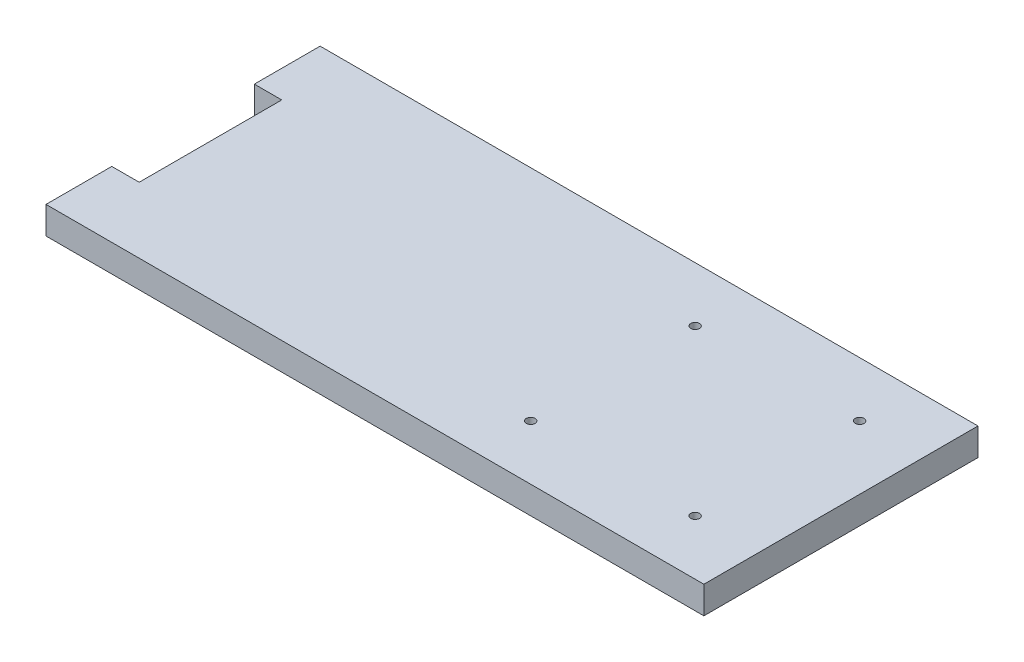
ISO-10303-21;
HEADER;
FILE_DESCRIPTION(('STEP AP214'),'2;1');
FILE_NAME('part.step','',(''),(''),'','','');
FILE_SCHEMA(('AUTOMOTIVE_DESIGN { 1 0 10303 214 1 1 1 1 }'));
ENDSEC;
DATA;
#1=APPLICATION_CONTEXT('core data for automotive mechanical design processes');
#2=APPLICATION_PROTOCOL_DEFINITION('international standard','automotive_design',2000,#1);
#3=PRODUCT_CONTEXT('',#1,'mechanical');
#4=PRODUCT('Part','Part','',(#3));
#5=PRODUCT_RELATED_PRODUCT_CATEGORY('part','',(#4));
#6=PRODUCT_DEFINITION_FORMATION('','',#4);
#7=PRODUCT_DEFINITION_CONTEXT('part definition',#1,'design');
#8=PRODUCT_DEFINITION('design','',#6,#7);
#9=PRODUCT_DEFINITION_SHAPE('','',#8);
#10=(LENGTH_UNIT() NAMED_UNIT(*) SI_UNIT(.MILLI.,.METRE.));
#11=(NAMED_UNIT(*) PLANE_ANGLE_UNIT() SI_UNIT($,.RADIAN.));
#12=(NAMED_UNIT(*) SI_UNIT($,.STERADIAN.) SOLID_ANGLE_UNIT());
#13=UNCERTAINTY_MEASURE_WITH_UNIT(LENGTH_MEASURE(1.E-05),#10,'distance_accuracy_value','');
#14=(GEOMETRIC_REPRESENTATION_CONTEXT(3) GLOBAL_UNCERTAINTY_ASSIGNED_CONTEXT((#13)) GLOBAL_UNIT_ASSIGNED_CONTEXT((#10,
#11,#12)) REPRESENTATION_CONTEXT('',''));
#15=CARTESIAN_POINT('',(0.,0.,0.));
#16=DIRECTION('',(0.,0.,1.));
#17=DIRECTION('',(1.,0.,0.));
#18=AXIS2_PLACEMENT_3D('',#15,#16,#17);
#19=CARTESIAN_POINT('',(-38.1,3.175,-15.875));
#20=DIRECTION('',(1.,0.,0.));
#21=DIRECTION('',(0.,0.,-1.));
#22=AXIS2_PLACEMENT_3D('',#19,#20,#21);
#23=PLANE('',#22);
#24=DIRECTION('',(0.,0.,1.));
#25=VECTOR('',#24,1.);
#26=CARTESIAN_POINT('',(-38.1,0.,-15.875));
#27=LINE('',#26,#25);
#28=CARTESIAN_POINT('',(-38.1,0.,-15.875));
#29=VERTEX_POINT('',#28);
#30=CARTESIAN_POINT('',(-38.1,0.,-8.255));
#31=VERTEX_POINT('',#30);
#32=EDGE_CURVE('E127',#29,#31,#27,.T.);
#33=ORIENTED_EDGE('',*,*,#32,.T.);
#34=DIRECTION('',(0.,1.,0.));
#35=VECTOR('',#34,1.);
#36=CARTESIAN_POINT('',(-38.1,0.,-8.255));
#37=LINE('',#36,#35);
#38=CARTESIAN_POINT('',(-38.1,3.175,-8.255));
#39=VERTEX_POINT('',#38);
#40=EDGE_CURVE('E160',#31,#39,#37,.T.);
#41=ORIENTED_EDGE('',*,*,#40,.T.);
#42=DIRECTION('',(0.,0.,1.));
#43=VECTOR('',#42,1.);
#44=CARTESIAN_POINT('',(-38.1,3.175,-15.875));
#45=LINE('',#44,#43);
#46=CARTESIAN_POINT('',(-38.1,3.175,-15.875));
#47=VERTEX_POINT('',#46);
#48=EDGE_CURVE('E146',#47,#39,#45,.T.);
#49=ORIENTED_EDGE('',*,*,#48,.F.);
#50=DIRECTION('',(0.,-1.,0.));
#51=VECTOR('',#50,1.);
#52=CARTESIAN_POINT('',(-38.1,3.175,-15.875));
#53=LINE('',#52,#51);
#54=EDGE_CURVE('E41',#47,#29,#53,.T.);
#55=ORIENTED_EDGE('',*,*,#54,.T.);
#56=EDGE_LOOP('',(#33,#41,#49,#55));
#57=FACE_BOUND('',#56,.T.);
#58=ADVANCED_FACE('F33',(#57),#23,.F.);
#59=CARTESIAN_POINT('',(38.1,3.175,-15.875));
#60=DIRECTION('',(-1.,0.,0.));
#61=DIRECTION('',(0.,0.,1.));
#62=AXIS2_PLACEMENT_3D('',#59,#60,#61);
#63=PLANE('',#62);
#64=DIRECTION('',(0.,0.,-1.));
#65=VECTOR('',#64,1.);
#66=CARTESIAN_POINT('',(38.1,0.,-15.875));
#67=LINE('',#66,#65);
#68=CARTESIAN_POINT('',(38.1,0.,15.875));
#69=VERTEX_POINT('',#68);
#70=CARTESIAN_POINT('',(38.1,0.,-15.875));
#71=VERTEX_POINT('',#70);
#72=EDGE_CURVE('E131',#69,#71,#67,.T.);
#73=ORIENTED_EDGE('',*,*,#72,.T.);
#74=DIRECTION('',(0.,-1.,0.));
#75=VECTOR('',#74,1.);
#76=CARTESIAN_POINT('',(38.1,3.175,-15.875));
#77=LINE('',#76,#75);
#78=CARTESIAN_POINT('',(38.1,3.175,-15.875));
#79=VERTEX_POINT('',#78);
#80=EDGE_CURVE('E11',#79,#71,#77,.T.);
#81=ORIENTED_EDGE('',*,*,#80,.F.);
#82=DIRECTION('',(0.,0.,-1.));
#83=VECTOR('',#82,1.);
#84=CARTESIAN_POINT('',(38.1,3.175,-15.875));
#85=LINE('',#84,#83);
#86=CARTESIAN_POINT('',(38.1,3.175,15.875));
#87=VERTEX_POINT('',#86);
#88=EDGE_CURVE('E136',#87,#79,#85,.T.);
#89=ORIENTED_EDGE('',*,*,#88,.F.);
#90=DIRECTION('',(0.,-1.,0.));
#91=VECTOR('',#90,1.);
#92=CARTESIAN_POINT('',(38.1,3.175,15.875));
#93=LINE('',#92,#91);
#94=EDGE_CURVE('E137',#87,#69,#93,.T.);
#95=ORIENTED_EDGE('',*,*,#94,.T.);
#96=EDGE_LOOP('',(#73,#81,#89,#95));
#97=FACE_BOUND('',#96,.T.);
#98=ADVANCED_FACE('F35',(#97),#63,.F.);
#99=CARTESIAN_POINT('',(-38.1,3.175,-15.875));
#100=DIRECTION('',(0.,0.,1.));
#101=DIRECTION('',(1.,0.,0.));
#102=AXIS2_PLACEMENT_3D('',#99,#100,#101);
#103=PLANE('',#102);
#104=DIRECTION('',(-1.,0.,0.));
#105=VECTOR('',#104,1.);
#106=CARTESIAN_POINT('',(-38.1,0.,-15.875));
#107=LINE('',#106,#105);
#108=EDGE_CURVE('E128',#71,#29,#107,.T.);
#109=ORIENTED_EDGE('',*,*,#108,.T.);
#110=ORIENTED_EDGE('',*,*,#54,.F.);
#111=DIRECTION('',(-1.,0.,0.));
#112=VECTOR('',#111,1.);
#113=CARTESIAN_POINT('',(-38.1,3.175,-15.875));
#114=LINE('',#113,#112);
#115=EDGE_CURVE('E85',#79,#47,#114,.T.);
#116=ORIENTED_EDGE('',*,*,#115,.F.);
#117=ORIENTED_EDGE('',*,*,#80,.T.);
#118=EDGE_LOOP('',(#109,#110,#116,#117));
#119=FACE_BOUND('',#118,.T.);
#120=ADVANCED_FACE('F182',(#119),#103,.F.);
#121=CARTESIAN_POINT('',(-38.1,3.175,8.25500000000001));
#122=VERTEX_POINT('',#121);
#123=CARTESIAN_POINT('',(-38.1,3.175,15.875));
#124=VERTEX_POINT('',#123);
#125=EDGE_CURVE('E122',#122,#124,#45,.T.);
#126=ORIENTED_EDGE('',*,*,#125,.F.);
#127=DIRECTION('',(0.,1.,0.));
#128=VECTOR('',#127,1.);
#129=CARTESIAN_POINT('',(-38.1,0.,8.25500000000001));
#130=LINE('',#129,#128);
#131=CARTESIAN_POINT('',(-38.1,0.,8.25500000000001));
#132=VERTEX_POINT('',#131);
#133=EDGE_CURVE('E110',#132,#122,#130,.T.);
#134=ORIENTED_EDGE('',*,*,#133,.F.);
#135=CARTESIAN_POINT('',(-38.1,0.,15.875));
#136=VERTEX_POINT('',#135);
#137=EDGE_CURVE('E121',#132,#136,#27,.T.);
#138=ORIENTED_EDGE('',*,*,#137,.T.);
#139=DIRECTION('',(0.,-1.,0.));
#140=VECTOR('',#139,1.);
#141=CARTESIAN_POINT('',(-38.1,3.175,15.875));
#142=LINE('',#141,#140);
#143=EDGE_CURVE('E139',#124,#136,#142,.T.);
#144=ORIENTED_EDGE('',*,*,#143,.F.);
#145=EDGE_LOOP('',(#126,#134,#138,#144));
#146=FACE_BOUND('',#145,.T.);
#147=ADVANCED_FACE('F119',(#146),#23,.F.);
#148=CARTESIAN_POINT('',(-38.1,3.175,15.875));
#149=DIRECTION('',(0.,0.,-1.));
#150=DIRECTION('',(-1.,0.,0.));
#151=AXIS2_PLACEMENT_3D('',#148,#149,#150);
#152=PLANE('',#151);
#153=DIRECTION('',(1.,0.,0.));
#154=VECTOR('',#153,1.);
#155=CARTESIAN_POINT('',(-38.1,0.,15.875));
#156=LINE('',#155,#154);
#157=EDGE_CURVE('E78',#136,#69,#156,.T.);
#158=ORIENTED_EDGE('',*,*,#157,.T.);
#159=ORIENTED_EDGE('',*,*,#94,.F.);
#160=DIRECTION('',(1.,0.,0.));
#161=VECTOR('',#160,1.);
#162=CARTESIAN_POINT('',(-38.1,3.175,15.875));
#163=LINE('',#162,#161);
#164=EDGE_CURVE('E57',#124,#87,#163,.T.);
#165=ORIENTED_EDGE('',*,*,#164,.F.);
#166=ORIENTED_EDGE('',*,*,#143,.T.);
#167=EDGE_LOOP('',(#158,#159,#165,#166));
#168=FACE_BOUND('',#167,.T.);
#169=ADVANCED_FACE('F172',(#168),#152,.F.);
#170=CARTESIAN_POINT('',(0.,3.175,0.));
#171=DIRECTION('',(0.,1.,0.));
#172=DIRECTION('',(0.,0.,1.));
#173=AXIS2_PLACEMENT_3D('',#170,#171,#172);
#174=PLANE('',#173);
#175=CARTESIAN_POINT('',(11.6870056405426,3.175,9.52500000000001));
#176=DIRECTION('',(0.,1.,0.));
#177=DIRECTION('',(0.,0.,1.));
#178=AXIS2_PLACEMENT_3D('',#175,#176,#177);
#179=CIRCLE('',#178,0.508000000000002);
#180=CARTESIAN_POINT('',(11.6870056405426,3.175,10.033));
#181=VERTEX_POINT('',#180);
#182=EDGE_CURVE('E291',#181,#181,#179,.T.);
#183=ORIENTED_EDGE('',*,*,#182,.F.);
#184=EDGE_LOOP('',(#183));
#185=FACE_BOUND('',#184,.T.);
#186=CARTESIAN_POINT('',(11.6870056405426,3.175,-9.52499999999999));
#187=DIRECTION('',(0.,1.,0.));
#188=DIRECTION('',(0.,0.,1.));
#189=AXIS2_PLACEMENT_3D('',#186,#187,#188);
#190=CIRCLE('',#189,0.508000000000002);
#191=CARTESIAN_POINT('',(11.6870056405426,3.175,-9.01699999999999));
#192=VERTEX_POINT('',#191);
#193=EDGE_CURVE('E293',#192,#192,#190,.T.);
#194=ORIENTED_EDGE('',*,*,#193,.F.);
#195=EDGE_LOOP('',(#194));
#196=FACE_BOUND('',#195,.T.);
#197=CARTESIAN_POINT('',(30.7370056405426,3.175,9.525));
#198=DIRECTION('',(0.,1.,0.));
#199=DIRECTION('',(0.,0.,1.));
#200=AXIS2_PLACEMENT_3D('',#197,#198,#199);
#201=CIRCLE('',#200,0.508000000000002);
#202=CARTESIAN_POINT('',(30.7370056405426,3.175,10.033));
#203=VERTEX_POINT('',#202);
#204=EDGE_CURVE('E299',#203,#203,#201,.T.);
#205=ORIENTED_EDGE('',*,*,#204,.F.);
#206=EDGE_LOOP('',(#205));
#207=FACE_BOUND('',#206,.T.);
#208=CARTESIAN_POINT('',(30.7370056405426,3.175,-9.525));
#209=DIRECTION('',(0.,1.,0.));
#210=DIRECTION('',(0.,0.,1.));
#211=AXIS2_PLACEMENT_3D('',#208,#209,#210);
#212=CIRCLE('',#211,0.508000000000002);
#213=CARTESIAN_POINT('',(30.7370056405426,3.175,-9.017));
#214=VERTEX_POINT('',#213);
#215=EDGE_CURVE('E305',#214,#214,#212,.T.);
#216=ORIENTED_EDGE('',*,*,#215,.F.);
#217=EDGE_LOOP('',(#216));
#218=FACE_BOUND('',#217,.T.);
#219=DIRECTION('',(-1.,0.,0.));
#220=VECTOR('',#219,1.);
#221=CARTESIAN_POINT('',(-38.1,3.175,-8.255));
#222=LINE('',#221,#220);
#223=CARTESIAN_POINT('',(-34.925,3.175,-8.255));
#224=VERTEX_POINT('',#223);
#225=EDGE_CURVE('E115',#224,#39,#222,.T.);
#226=ORIENTED_EDGE('',*,*,#225,.F.);
#227=DIRECTION('',(0.,0.,-1.));
#228=VECTOR('',#227,1.);
#229=CARTESIAN_POINT('',(-34.925,3.175,-8.255));
#230=LINE('',#229,#228);
#231=CARTESIAN_POINT('',(-34.925,3.175,8.25500000000001));
#232=VERTEX_POINT('',#231);
#233=EDGE_CURVE('E155',#232,#224,#230,.T.);
#234=ORIENTED_EDGE('',*,*,#233,.F.);
#235=DIRECTION('',(1.,0.,0.));
#236=VECTOR('',#235,1.);
#237=CARTESIAN_POINT('',(-38.1,3.175,8.25500000000001));
#238=LINE('',#237,#236);
#239=EDGE_CURVE('E153',#122,#232,#238,.T.);
#240=ORIENTED_EDGE('',*,*,#239,.F.);
#241=ORIENTED_EDGE('',*,*,#125,.T.);
#242=ORIENTED_EDGE('',*,*,#164,.T.);
#243=ORIENTED_EDGE('',*,*,#88,.T.);
#244=ORIENTED_EDGE('',*,*,#115,.T.);
#245=ORIENTED_EDGE('',*,*,#48,.T.);
#246=EDGE_LOOP('',(#226,#234,#240,#241,#242,#243,#244,#245));
#247=FACE_BOUND('',#246,.T.);
#248=ADVANCED_FACE('F174',(#185,#196,#207,#218,#247),#174,.T.);
#249=CARTESIAN_POINT('',(0.,0.,0.));
#250=DIRECTION('',(0.,1.,0.));
#251=DIRECTION('',(0.,0.,1.));
#252=AXIS2_PLACEMENT_3D('',#249,#250,#251);
#253=PLANE('',#252);
#254=CARTESIAN_POINT('',(11.6870056405426,0.,9.52500000000001));
#255=DIRECTION('',(0.,1.,0.));
#256=DIRECTION('',(0.,0.,1.));
#257=AXIS2_PLACEMENT_3D('',#254,#255,#256);
#258=CIRCLE('',#257,0.508000000000002);
#259=CARTESIAN_POINT('',(11.6870056405426,0.,10.033));
#260=VERTEX_POINT('',#259);
#261=EDGE_CURVE('E288',#260,#260,#258,.T.);
#262=ORIENTED_EDGE('',*,*,#261,.T.);
#263=EDGE_LOOP('',(#262));
#264=FACE_BOUND('',#263,.T.);
#265=CARTESIAN_POINT('',(11.6870056405426,0.,-9.52499999999999));
#266=DIRECTION('',(0.,1.,0.));
#267=DIRECTION('',(0.,0.,1.));
#268=AXIS2_PLACEMENT_3D('',#265,#266,#267);
#269=CIRCLE('',#268,0.508000000000002);
#270=CARTESIAN_POINT('',(11.6870056405426,0.,-9.01699999999999));
#271=VERTEX_POINT('',#270);
#272=EDGE_CURVE('E296',#271,#271,#269,.T.);
#273=ORIENTED_EDGE('',*,*,#272,.T.);
#274=EDGE_LOOP('',(#273));
#275=FACE_BOUND('',#274,.T.);
#276=CARTESIAN_POINT('',(30.7370056405426,0.,9.525));
#277=DIRECTION('',(0.,1.,0.));
#278=DIRECTION('',(0.,0.,1.));
#279=AXIS2_PLACEMENT_3D('',#276,#277,#278);
#280=CIRCLE('',#279,0.508000000000002);
#281=CARTESIAN_POINT('',(30.7370056405426,0.,10.033));
#282=VERTEX_POINT('',#281);
#283=EDGE_CURVE('E302',#282,#282,#280,.T.);
#284=ORIENTED_EDGE('',*,*,#283,.T.);
#285=EDGE_LOOP('',(#284));
#286=FACE_BOUND('',#285,.T.);
#287=CARTESIAN_POINT('',(30.7370056405426,0.,-9.525));
#288=DIRECTION('',(0.,1.,0.));
#289=DIRECTION('',(0.,0.,1.));
#290=AXIS2_PLACEMENT_3D('',#287,#288,#289);
#291=CIRCLE('',#290,0.508000000000002);
#292=CARTESIAN_POINT('',(30.7370056405426,0.,-9.017));
#293=VERTEX_POINT('',#292);
#294=EDGE_CURVE('E156',#293,#293,#291,.T.);
#295=ORIENTED_EDGE('',*,*,#294,.T.);
#296=EDGE_LOOP('',(#295));
#297=FACE_BOUND('',#296,.T.);
#298=DIRECTION('',(0.,0.,-1.));
#299=VECTOR('',#298,1.);
#300=CARTESIAN_POINT('',(-34.925,0.,-8.255));
#301=LINE('',#300,#299);
#302=CARTESIAN_POINT('',(-34.925,0.,8.25500000000001));
#303=VERTEX_POINT('',#302);
#304=CARTESIAN_POINT('',(-34.925,0.,-8.255));
#305=VERTEX_POINT('',#304);
#306=EDGE_CURVE('E48',#303,#305,#301,.T.);
#307=ORIENTED_EDGE('',*,*,#306,.T.);
#308=DIRECTION('',(-1.,0.,0.));
#309=VECTOR('',#308,1.);
#310=CARTESIAN_POINT('',(-38.1,0.,-8.255));
#311=LINE('',#310,#309);
#312=EDGE_CURVE('E123',#305,#31,#311,.T.);
#313=ORIENTED_EDGE('',*,*,#312,.T.);
#314=ORIENTED_EDGE('',*,*,#32,.F.);
#315=ORIENTED_EDGE('',*,*,#108,.F.);
#316=ORIENTED_EDGE('',*,*,#72,.F.);
#317=ORIENTED_EDGE('',*,*,#157,.F.);
#318=ORIENTED_EDGE('',*,*,#137,.F.);
#319=DIRECTION('',(1.,0.,0.));
#320=VECTOR('',#319,1.);
#321=CARTESIAN_POINT('',(-38.1,0.,8.25500000000001));
#322=LINE('',#321,#320);
#323=EDGE_CURVE('E106',#132,#303,#322,.T.);
#324=ORIENTED_EDGE('',*,*,#323,.T.);
#325=EDGE_LOOP('',(#307,#313,#314,#315,#316,#317,#318,#324));
#326=FACE_BOUND('',#325,.T.);
#327=ADVANCED_FACE('F125',(#264,#275,#286,#297,#326),#253,.F.);
#328=CARTESIAN_POINT('',(-38.1,0.,-8.255));
#329=DIRECTION('',(0.,0.,-1.));
#330=DIRECTION('',(-1.,0.,0.));
#331=AXIS2_PLACEMENT_3D('',#328,#329,#330);
#332=PLANE('',#331);
#333=ORIENTED_EDGE('',*,*,#225,.T.);
#334=ORIENTED_EDGE('',*,*,#40,.F.);
#335=ORIENTED_EDGE('',*,*,#312,.F.);
#336=DIRECTION('',(0.,1.,0.));
#337=VECTOR('',#336,1.);
#338=CARTESIAN_POINT('',(-34.925,0.,-8.255));
#339=LINE('',#338,#337);
#340=EDGE_CURVE('E162',#305,#224,#339,.T.);
#341=ORIENTED_EDGE('',*,*,#340,.T.);
#342=EDGE_LOOP('',(#333,#334,#335,#341));
#343=FACE_BOUND('',#342,.T.);
#344=ADVANCED_FACE('F216',(#343),#332,.F.);
#345=CARTESIAN_POINT('',(-34.925,0.,-8.255));
#346=DIRECTION('',(1.,0.,0.));
#347=DIRECTION('',(0.,0.,-1.));
#348=AXIS2_PLACEMENT_3D('',#345,#346,#347);
#349=PLANE('',#348);
#350=ORIENTED_EDGE('',*,*,#233,.T.);
#351=ORIENTED_EDGE('',*,*,#340,.F.);
#352=ORIENTED_EDGE('',*,*,#306,.F.);
#353=DIRECTION('',(0.,1.,0.));
#354=VECTOR('',#353,1.);
#355=CARTESIAN_POINT('',(-34.925,0.,8.25500000000001));
#356=LINE('',#355,#354);
#357=EDGE_CURVE('E112',#303,#232,#356,.T.);
#358=ORIENTED_EDGE('',*,*,#357,.T.);
#359=EDGE_LOOP('',(#350,#351,#352,#358));
#360=FACE_BOUND('',#359,.T.);
#361=ADVANCED_FACE('F225',(#360),#349,.F.);
#362=CARTESIAN_POINT('',(-38.1,0.,8.25500000000001));
#363=DIRECTION('',(0.,0.,1.));
#364=DIRECTION('',(1.,0.,0.));
#365=AXIS2_PLACEMENT_3D('',#362,#363,#364);
#366=PLANE('',#365);
#367=ORIENTED_EDGE('',*,*,#239,.T.);
#368=ORIENTED_EDGE('',*,*,#357,.F.);
#369=ORIENTED_EDGE('',*,*,#323,.F.);
#370=ORIENTED_EDGE('',*,*,#133,.T.);
#371=EDGE_LOOP('',(#367,#368,#369,#370));
#372=FACE_BOUND('',#371,.T.);
#373=ADVANCED_FACE('F109',(#372),#366,.F.);
#374=CARTESIAN_POINT('',(30.7370056405426,0.,-9.525));
#375=DIRECTION('',(0.,1.,0.));
#376=DIRECTION('',(0.,0.,1.));
#377=AXIS2_PLACEMENT_3D('',#374,#375,#376);
#378=CYLINDRICAL_SURFACE('',#377,0.508000000000002);
#379=ORIENTED_EDGE('',*,*,#294,.F.);
#380=EDGE_LOOP('',(#379));
#381=FACE_BOUND('',#380,.T.);
#382=ORIENTED_EDGE('',*,*,#215,.T.);
#383=EDGE_LOOP('',(#382));
#384=FACE_BOUND('',#383,.T.);
#385=ADVANCED_FACE('F242',(#381,#384),#378,.F.);
#386=CARTESIAN_POINT('',(30.7370056405426,0.,9.525));
#387=DIRECTION('',(0.,1.,0.));
#388=DIRECTION('',(0.,0.,1.));
#389=AXIS2_PLACEMENT_3D('',#386,#387,#388);
#390=CYLINDRICAL_SURFACE('',#389,0.508000000000002);
#391=ORIENTED_EDGE('',*,*,#283,.F.);
#392=EDGE_LOOP('',(#391));
#393=FACE_BOUND('',#392,.T.);
#394=ORIENTED_EDGE('',*,*,#204,.T.);
#395=EDGE_LOOP('',(#394));
#396=FACE_BOUND('',#395,.T.);
#397=ADVANCED_FACE('F251',(#393,#396),#390,.F.);
#398=CARTESIAN_POINT('',(11.6870056405426,0.,-9.52499999999999));
#399=DIRECTION('',(0.,1.,0.));
#400=DIRECTION('',(0.,0.,1.));
#401=AXIS2_PLACEMENT_3D('',#398,#399,#400);
#402=CYLINDRICAL_SURFACE('',#401,0.508000000000002);
#403=ORIENTED_EDGE('',*,*,#272,.F.);
#404=EDGE_LOOP('',(#403));
#405=FACE_BOUND('',#404,.T.);
#406=ORIENTED_EDGE('',*,*,#193,.T.);
#407=EDGE_LOOP('',(#406));
#408=FACE_BOUND('',#407,.T.);
#409=ADVANCED_FACE('F261',(#405,#408),#402,.F.);
#410=CARTESIAN_POINT('',(11.6870056405426,0.,9.52500000000001));
#411=DIRECTION('',(0.,1.,0.));
#412=DIRECTION('',(0.,0.,1.));
#413=AXIS2_PLACEMENT_3D('',#410,#411,#412);
#414=CYLINDRICAL_SURFACE('',#413,0.508000000000002);
#415=ORIENTED_EDGE('',*,*,#261,.F.);
#416=EDGE_LOOP('',(#415));
#417=FACE_BOUND('',#416,.T.);
#418=ORIENTED_EDGE('',*,*,#182,.T.);
#419=EDGE_LOOP('',(#418));
#420=FACE_BOUND('',#419,.T.);
#421=ADVANCED_FACE('F271',(#417,#420),#414,.F.);
#422=CLOSED_SHELL('',(#58,#98,#120,#147,#169,#248,#327,#344,#361,#373,#385,#397,#409,#421));
#423=MANIFOLD_SOLID_BREP('B2',#422);
#424=ADVANCED_BREP_SHAPE_REPRESENTATION('',(#18,#423),#14);
#425=SHAPE_DEFINITION_REPRESENTATION(#9,#424);
ENDSEC;
END-ISO-10303-21;
